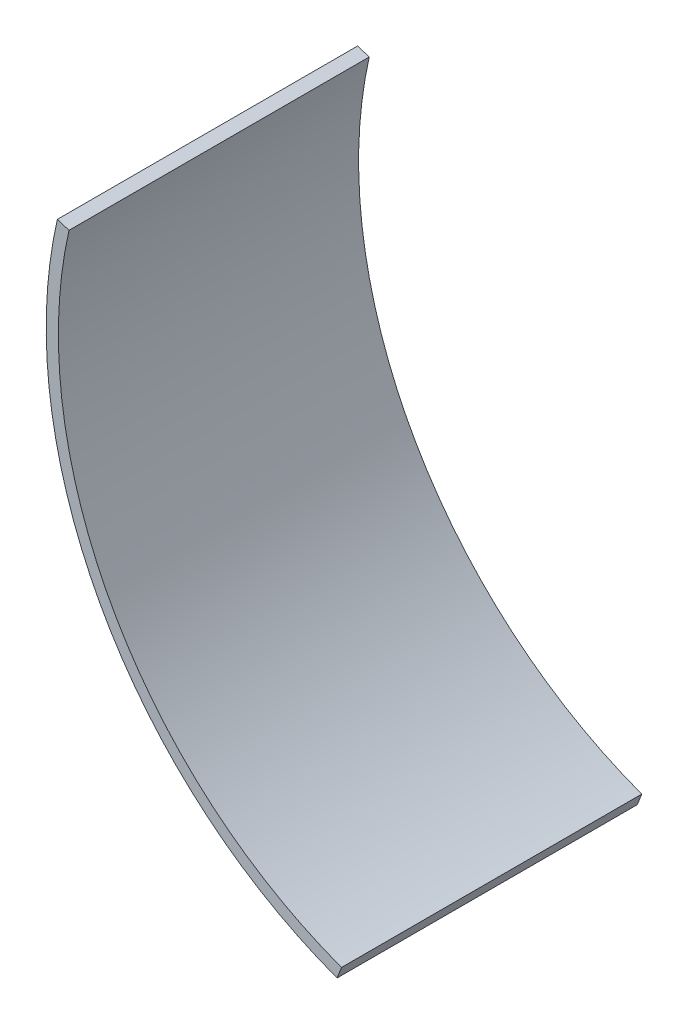
ISO-10303-21;
HEADER;
FILE_DESCRIPTION(('STEP AP214'),'2;1');
FILE_NAME('part.step','',(''),(''),'','','');
FILE_SCHEMA(('AUTOMOTIVE_DESIGN { 1 0 10303 214 1 1 1 1 }'));
ENDSEC;
DATA;
#1=APPLICATION_CONTEXT('core data for automotive mechanical design processes');
#2=APPLICATION_PROTOCOL_DEFINITION('international standard','automotive_design',2000,#1);
#3=PRODUCT_CONTEXT('',#1,'mechanical');
#4=PRODUCT('Part','Part','',(#3));
#5=PRODUCT_RELATED_PRODUCT_CATEGORY('part','',(#4));
#6=PRODUCT_DEFINITION_FORMATION('','',#4);
#7=PRODUCT_DEFINITION_CONTEXT('part definition',#1,'design');
#8=PRODUCT_DEFINITION('design','',#6,#7);
#9=PRODUCT_DEFINITION_SHAPE('','',#8);
#10=(LENGTH_UNIT() NAMED_UNIT(*) SI_UNIT(.MILLI.,.METRE.));
#11=(NAMED_UNIT(*) PLANE_ANGLE_UNIT() SI_UNIT($,.RADIAN.));
#12=(NAMED_UNIT(*) SI_UNIT($,.STERADIAN.) SOLID_ANGLE_UNIT());
#13=UNCERTAINTY_MEASURE_WITH_UNIT(LENGTH_MEASURE(1.E-05),#10,'distance_accuracy_value','');
#14=(GEOMETRIC_REPRESENTATION_CONTEXT(3) GLOBAL_UNCERTAINTY_ASSIGNED_CONTEXT((#13)) GLOBAL_UNIT_ASSIGNED_CONTEXT((#10,
#11,#12)) REPRESENTATION_CONTEXT('',''));
#15=CARTESIAN_POINT('',(0.,0.,0.));
#16=DIRECTION('',(0.,0.,1.));
#17=DIRECTION('',(1.,0.,0.));
#18=AXIS2_PLACEMENT_3D('',#15,#16,#17);
#19=CARTESIAN_POINT('',(3243.45082456271,1808.28370384598,370.));
#20=DIRECTION('',(0.,0.,-1.));
#21=DIRECTION('',(-1.,0.,0.));
#22=AXIS2_PLACEMENT_3D('',#19,#20,#21);
#23=CYLINDRICAL_SURFACE('',#22,534.387659983748);
#24=CARTESIAN_POINT('',(3243.45082456271,1808.28370384598,0.));
#25=DIRECTION('',(0.,0.,1.));
#26=DIRECTION('',(1.,0.,0.));
#27=AXIS2_PLACEMENT_3D('',#24,#25,#26);
#28=CIRCLE('',#27,534.387659983748);
#29=CARTESIAN_POINT('',(2722.16389424815,1925.88518098862,0.));
#30=VERTEX_POINT('',#29);
#31=CARTESIAN_POINT('',(3057.99719968873,1307.10796205074,0.));
#32=VERTEX_POINT('',#31);
#33=EDGE_CURVE('E95',#30,#32,#28,.T.);
#34=ORIENTED_EDGE('',*,*,#33,.F.);
#35=DIRECTION('',(0.,0.,-1.));
#36=VECTOR('',#35,1.);
#37=CARTESIAN_POINT('',(2722.16389424815,1925.88518098862,370.));
#38=LINE('',#37,#36);
#39=CARTESIAN_POINT('',(2722.16389424815,1925.88518098862,370.));
#40=VERTEX_POINT('',#39);
#41=EDGE_CURVE('E11',#40,#30,#38,.T.);
#42=ORIENTED_EDGE('',*,*,#41,.F.);
#43=CARTESIAN_POINT('',(3243.45082456271,1808.28370384598,370.));
#44=DIRECTION('',(0.,0.,1.));
#45=DIRECTION('',(1.,0.,0.));
#46=AXIS2_PLACEMENT_3D('',#43,#44,#45);
#47=CIRCLE('',#46,534.387659983748);
#48=CARTESIAN_POINT('',(3057.99719968873,1307.10796205074,370.));
#49=VERTEX_POINT('',#48);
#50=EDGE_CURVE('E89',#40,#49,#47,.T.);
#51=ORIENTED_EDGE('',*,*,#50,.T.);
#52=DIRECTION('',(0.,0.,-1.));
#53=VECTOR('',#52,1.);
#54=CARTESIAN_POINT('',(3057.99719968873,1307.10796205074,370.));
#55=LINE('',#54,#53);
#56=EDGE_CURVE('E70',#49,#32,#55,.T.);
#57=ORIENTED_EDGE('',*,*,#56,.T.);
#58=EDGE_LOOP('',(#34,#42,#51,#57));
#59=FACE_BOUND('',#58,.T.);
#60=ADVANCED_FACE('F32',(#59),#23,.F.);
#61=CARTESIAN_POINT('',(798.951636533948,2532.59605966858,370.));
#62=DIRECTION('',(0.300852104091896,0.953670808750839,0.));
#63=DIRECTION('',(-0.953670808750839,0.300852104091896,0.));
#64=AXIS2_PLACEMENT_3D('',#61,#62,#63);
#65=PLANE('',#64);
#66=DIRECTION('',(0.953670808750839,-0.300852104091896,0.));
#67=VECTOR('',#66,1.);
#68=CARTESIAN_POINT('',(798.951636533948,2532.59605966858,0.));
#69=LINE('',#68,#67);
#70=CARTESIAN_POINT('',(2707.80995361861,1930.41338212552,0.));
#71=VERTEX_POINT('',#70);
#72=EDGE_CURVE('E83',#71,#30,#69,.T.);
#73=ORIENTED_EDGE('',*,*,#72,.F.);
#74=DIRECTION('',(0.,0.,-1.));
#75=VECTOR('',#74,1.);
#76=CARTESIAN_POINT('',(2707.80995361861,1930.41338212552,370.));
#77=LINE('',#76,#75);
#78=CARTESIAN_POINT('',(2707.80995361861,1930.41338212552,370.));
#79=VERTEX_POINT('',#78);
#80=EDGE_CURVE('E40',#79,#71,#77,.T.);
#81=ORIENTED_EDGE('',*,*,#80,.F.);
#82=DIRECTION('',(0.953670808750839,-0.300852104091896,0.));
#83=VECTOR('',#82,1.);
#84=CARTESIAN_POINT('',(798.951636533948,2532.59605966858,370.));
#85=LINE('',#84,#83);
#86=EDGE_CURVE('E81',#79,#40,#85,.T.);
#87=ORIENTED_EDGE('',*,*,#86,.T.);
#88=ORIENTED_EDGE('',*,*,#41,.T.);
#89=EDGE_LOOP('',(#73,#81,#87,#88));
#90=FACE_BOUND('',#89,.T.);
#91=ADVANCED_FACE('F79',(#90),#65,.T.);
#92=CARTESIAN_POINT('',(3243.45082456271,1808.28370384598,370.));
#93=DIRECTION('',(0.,0.,-1.));
#94=DIRECTION('',(-1.,0.,0.));
#95=AXIS2_PLACEMENT_3D('',#92,#93,#94);
#96=CYLINDRICAL_SURFACE('',#95,549.387659983748);
#97=CARTESIAN_POINT('',(3243.45082456271,1808.28370384598,0.));
#98=DIRECTION('',(0.,0.,1.));
#99=DIRECTION('',(1.,0.,0.));
#100=AXIS2_PLACEMENT_3D('',#97,#98,#99);
#101=CIRCLE('',#100,549.387659983748);
#102=CARTESIAN_POINT('',(3052.55928390283,1293.12623214736,0.));
#103=VERTEX_POINT('',#102);
#104=EDGE_CURVE('E63',#71,#103,#101,.T.);
#105=ORIENTED_EDGE('',*,*,#104,.T.);
#106=DIRECTION('',(0.,0.,-1.));
#107=VECTOR('',#106,1.);
#108=CARTESIAN_POINT('',(3052.55928390283,1293.12623214736,370.));
#109=LINE('',#108,#107);
#110=CARTESIAN_POINT('',(3052.55928390283,1293.12623214736,370.));
#111=VERTEX_POINT('',#110);
#112=EDGE_CURVE('E84',#111,#103,#109,.T.);
#113=ORIENTED_EDGE('',*,*,#112,.F.);
#114=CARTESIAN_POINT('',(3243.45082456271,1808.28370384598,370.));
#115=DIRECTION('',(0.,0.,1.));
#116=DIRECTION('',(1.,0.,0.));
#117=AXIS2_PLACEMENT_3D('',#114,#115,#116);
#118=CIRCLE('',#117,549.387659983748);
#119=EDGE_CURVE('E85',#79,#111,#118,.T.);
#120=ORIENTED_EDGE('',*,*,#119,.F.);
#121=ORIENTED_EDGE('',*,*,#80,.T.);
#122=EDGE_LOOP('',(#105,#113,#120,#121));
#123=FACE_BOUND('',#122,.T.);
#124=ADVANCED_FACE('F86',(#123),#96,.T.);
#125=CARTESIAN_POINT('',(2214.62472795747,-861.334244847671,370.));
#126=DIRECTION('',(-0.931991692548014,0.362479633940293,0.));
#127=DIRECTION('',(-0.362479633940293,-0.931991692548014,0.));
#128=AXIS2_PLACEMENT_3D('',#125,#126,#127);
#129=PLANE('',#128);
#130=DIRECTION('',(0.362479633940293,0.931991692548014,0.));
#131=VECTOR('',#130,1.);
#132=CARTESIAN_POINT('',(2214.62472795747,-861.334244847671,0.));
#133=LINE('',#132,#131);
#134=EDGE_CURVE('E91',#103,#32,#133,.T.);
#135=ORIENTED_EDGE('',*,*,#134,.T.);
#136=ORIENTED_EDGE('',*,*,#56,.F.);
#137=DIRECTION('',(0.362479633940293,0.931991692548014,0.));
#138=VECTOR('',#137,1.);
#139=CARTESIAN_POINT('',(2214.62472795747,-861.334244847671,370.));
#140=LINE('',#139,#138);
#141=EDGE_CURVE('E48',#111,#49,#140,.T.);
#142=ORIENTED_EDGE('',*,*,#141,.F.);
#143=ORIENTED_EDGE('',*,*,#112,.T.);
#144=EDGE_LOOP('',(#135,#136,#142,#143));
#145=FACE_BOUND('',#144,.T.);
#146=ADVANCED_FACE('F104',(#145),#129,.F.);
#147=CARTESIAN_POINT('',(0.,0.,370.));
#148=DIRECTION('',(0.,0.,1.));
#149=DIRECTION('',(1.,0.,0.));
#150=AXIS2_PLACEMENT_3D('',#147,#148,#149);
#151=PLANE('',#150);
#152=ORIENTED_EDGE('',*,*,#50,.F.);
#153=ORIENTED_EDGE('',*,*,#86,.F.);
#154=ORIENTED_EDGE('',*,*,#119,.T.);
#155=ORIENTED_EDGE('',*,*,#141,.T.);
#156=EDGE_LOOP('',(#152,#153,#154,#155));
#157=FACE_BOUND('',#156,.T.);
#158=ADVANCED_FACE('F88',(#157),#151,.T.);
#159=CARTESIAN_POINT('',(0.,0.,0.));
#160=DIRECTION('',(0.,0.,1.));
#161=DIRECTION('',(1.,0.,0.));
#162=AXIS2_PLACEMENT_3D('',#159,#160,#161);
#163=PLANE('',#162);
#164=ORIENTED_EDGE('',*,*,#33,.T.);
#165=ORIENTED_EDGE('',*,*,#134,.F.);
#166=ORIENTED_EDGE('',*,*,#104,.F.);
#167=ORIENTED_EDGE('',*,*,#72,.T.);
#168=EDGE_LOOP('',(#164,#165,#166,#167));
#169=FACE_BOUND('',#168,.T.);
#170=ADVANCED_FACE('F106',(#169),#163,.F.);
#171=CLOSED_SHELL('',(#60,#91,#124,#146,#158,#170));
#172=MANIFOLD_SOLID_BREP('B2',#171);
#173=ADVANCED_BREP_SHAPE_REPRESENTATION('',(#18,#172),#14);
#174=SHAPE_DEFINITION_REPRESENTATION(#9,#173);
ENDSEC;
END-ISO-10303-21;
